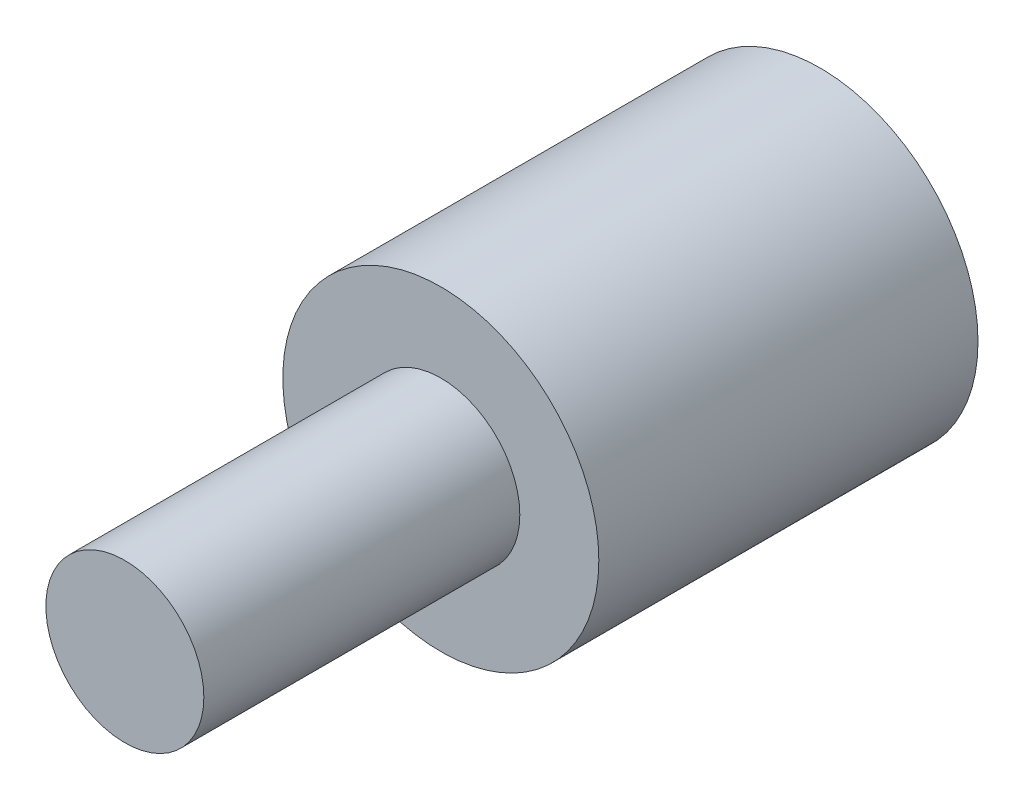
ISO-10303-21;
HEADER;
FILE_DESCRIPTION(('STEP AP214'),'2;1');
FILE_NAME('part.step','',(''),(''),'','','');
FILE_SCHEMA(('AUTOMOTIVE_DESIGN { 1 0 10303 214 1 1 1 1 }'));
ENDSEC;
DATA;
#1=APPLICATION_CONTEXT('core data for automotive mechanical design processes');
#2=APPLICATION_PROTOCOL_DEFINITION('international standard','automotive_design',2000,#1);
#3=PRODUCT_CONTEXT('',#1,'mechanical');
#4=PRODUCT('Part','Part','',(#3));
#5=PRODUCT_RELATED_PRODUCT_CATEGORY('part','',(#4));
#6=PRODUCT_DEFINITION_FORMATION('','',#4);
#7=PRODUCT_DEFINITION_CONTEXT('part definition',#1,'design');
#8=PRODUCT_DEFINITION('design','',#6,#7);
#9=PRODUCT_DEFINITION_SHAPE('','',#8);
#10=(LENGTH_UNIT() NAMED_UNIT(*) SI_UNIT(.MILLI.,.METRE.));
#11=(NAMED_UNIT(*) PLANE_ANGLE_UNIT() SI_UNIT($,.RADIAN.));
#12=(NAMED_UNIT(*) SI_UNIT($,.STERADIAN.) SOLID_ANGLE_UNIT());
#13=UNCERTAINTY_MEASURE_WITH_UNIT(LENGTH_MEASURE(1.E-05),#10,'distance_accuracy_value','');
#14=(GEOMETRIC_REPRESENTATION_CONTEXT(3) GLOBAL_UNCERTAINTY_ASSIGNED_CONTEXT((#13)) GLOBAL_UNIT_ASSIGNED_CONTEXT((#10,
#11,#12)) REPRESENTATION_CONTEXT('',''));
#15=CARTESIAN_POINT('',(0.,0.,0.));
#16=DIRECTION('',(0.,0.,1.));
#17=DIRECTION('',(1.,0.,0.));
#18=AXIS2_PLACEMENT_3D('',#15,#16,#17);
#19=CARTESIAN_POINT('',(0.,0.,-60.));
#20=DIRECTION('',(0.,0.,1.));
#21=DIRECTION('',(1.,0.,0.));
#22=AXIS2_PLACEMENT_3D('',#19,#20,#21);
#23=CYLINDRICAL_SURFACE('',#22,25.);
#24=CARTESIAN_POINT('',(0.,0.,-60.));
#25=DIRECTION('',(0.,0.,1.));
#26=DIRECTION('',(1.,0.,0.));
#27=AXIS2_PLACEMENT_3D('',#24,#25,#26);
#28=CIRCLE('',#27,25.);
#29=CARTESIAN_POINT('',(25.,0.,-60.));
#30=VERTEX_POINT('',#29);
#31=EDGE_CURVE('E45',#30,#30,#28,.T.);
#32=CARTESIAN_POINT('',(0.,0.,0.));
#33=DIRECTION('',(0.,0.,1.));
#34=DIRECTION('',(1.,0.,0.));
#35=AXIS2_PLACEMENT_3D('',#32,#33,#34);
#36=CIRCLE('',#35,25.);
#37=CARTESIAN_POINT('',(25.,0.,0.));
#38=VERTEX_POINT('',#37);
#39=EDGE_CURVE('E40',#38,#38,#36,.T.);
#40=CARTESIAN_POINT('',(25.,0.,-60.));
#41=CARTESIAN_POINT('',(25.,0.,-59.375));
#42=CARTESIAN_POINT('',(25.,0.,-58.75));
#43=CARTESIAN_POINT('',(25.,0.,-57.5));
#44=CARTESIAN_POINT('',(25.,0.,-56.875));
#45=CARTESIAN_POINT('',(25.,0.,-55.625));
#46=CARTESIAN_POINT('',(25.,0.,-55.));
#47=CARTESIAN_POINT('',(25.,0.,-53.75));
#48=CARTESIAN_POINT('',(25.,0.,-53.125));
#49=CARTESIAN_POINT('',(25.,0.,-51.875));
#50=CARTESIAN_POINT('',(25.,0.,-51.25));
#51=CARTESIAN_POINT('',(25.,0.,-50.));
#52=CARTESIAN_POINT('',(25.,0.,-49.375));
#53=CARTESIAN_POINT('',(25.,0.,-48.125));
#54=CARTESIAN_POINT('',(25.,0.,-47.5));
#55=CARTESIAN_POINT('',(25.,0.,-46.25));
#56=CARTESIAN_POINT('',(25.,0.,-45.625));
#57=CARTESIAN_POINT('',(25.,0.,-44.375));
#58=CARTESIAN_POINT('',(25.,0.,-43.75));
#59=CARTESIAN_POINT('',(25.,0.,-42.5));
#60=CARTESIAN_POINT('',(25.,0.,-41.875));
#61=CARTESIAN_POINT('',(25.,0.,-40.625));
#62=CARTESIAN_POINT('',(25.,0.,-40.));
#63=CARTESIAN_POINT('',(25.,0.,-38.75));
#64=CARTESIAN_POINT('',(25.,0.,-38.125));
#65=CARTESIAN_POINT('',(25.,0.,-36.875));
#66=CARTESIAN_POINT('',(25.,0.,-36.25));
#67=CARTESIAN_POINT('',(25.,0.,-35.));
#68=CARTESIAN_POINT('',(25.,0.,-34.375));
#69=CARTESIAN_POINT('',(25.,0.,-33.125));
#70=CARTESIAN_POINT('',(25.,0.,-32.5));
#71=CARTESIAN_POINT('',(25.,0.,-31.25));
#72=CARTESIAN_POINT('',(25.,0.,-30.625));
#73=CARTESIAN_POINT('',(25.,0.,-29.375));
#74=CARTESIAN_POINT('',(25.,0.,-28.75));
#75=CARTESIAN_POINT('',(25.,0.,-27.5));
#76=CARTESIAN_POINT('',(25.,0.,-26.875));
#77=CARTESIAN_POINT('',(25.,0.,-25.625));
#78=CARTESIAN_POINT('',(25.,0.,-25.));
#79=CARTESIAN_POINT('',(25.,0.,-23.75));
#80=CARTESIAN_POINT('',(25.,0.,-23.125));
#81=CARTESIAN_POINT('',(25.,0.,-21.875));
#82=CARTESIAN_POINT('',(25.,0.,-21.25));
#83=CARTESIAN_POINT('',(25.,0.,-20.));
#84=CARTESIAN_POINT('',(25.,0.,-19.375));
#85=CARTESIAN_POINT('',(25.,0.,-18.125));
#86=CARTESIAN_POINT('',(25.,0.,-17.5));
#87=CARTESIAN_POINT('',(25.,0.,-16.25));
#88=CARTESIAN_POINT('',(25.,0.,-15.625));
#89=CARTESIAN_POINT('',(25.,0.,-14.375));
#90=CARTESIAN_POINT('',(25.,0.,-13.75));
#91=CARTESIAN_POINT('',(25.,0.,-12.5));
#92=CARTESIAN_POINT('',(25.,0.,-11.875));
#93=CARTESIAN_POINT('',(25.,0.,-10.625));
#94=CARTESIAN_POINT('',(25.,0.,-10.));
#95=CARTESIAN_POINT('',(25.,0.,-8.75));
#96=CARTESIAN_POINT('',(25.,0.,-8.125));
#97=CARTESIAN_POINT('',(25.,0.,-6.875));
#98=CARTESIAN_POINT('',(25.,0.,-6.25));
#99=CARTESIAN_POINT('',(25.,0.,-5.));
#100=CARTESIAN_POINT('',(25.,0.,-4.375));
#101=CARTESIAN_POINT('',(25.,0.,-3.125));
#102=CARTESIAN_POINT('',(25.,0.,-2.5));
#103=CARTESIAN_POINT('',(25.,0.,-1.25));
#104=CARTESIAN_POINT('',(25.,0.,-0.625000000000001));
#105=CARTESIAN_POINT('',(25.,0.,0.));
#106=B_SPLINE_CURVE_WITH_KNOTS('',3,(#40,#41,#42,#43,#44,#45,#46,#47,#48,#49,#50,#51,#52,#53,
#54,#55,#56,#57,#58,#59,#60,#61,#62,#63,#64,#65,#66,#67,#68,#69,#70,#71,#72,#73,#74,#75,#76,#77,
#78,#79,#80,#81,#82,#83,#84,#85,#86,#87,#88,#89,#90,#91,#92,#93,#94,#95,#96,#97,#98,#99,#100,
#101,#102,#103,#104,#105),.UNSPECIFIED.,.F.,.F.,(4,2,2,2,2,2,2,2,2,2,2,2,2,2,2,2,2,2,2,2,2,2,2,
2,2,2,2,2,2,2,2,2,4),(0.,1.875,3.75,5.62500000000001,7.50000000000001,9.37500000000001,11.25,
13.125,15.,16.875,18.75,20.625,22.5,24.375,26.25,28.125,30.,31.875,33.75,35.625,37.5,39.375,
41.25,43.125,45.,46.875,48.75,50.625,52.5,54.375,56.25,58.125,60.),.UNSPECIFIED.);
#107=EDGE_CURVE('BSEAM37',#30,#38,#106,.T.);
#108=ORIENTED_EDGE('',*,*,#31,.T.);
#109=ORIENTED_EDGE('',*,*,#39,.F.);
#110=ORIENTED_EDGE('',*,*,#107,.T.);
#111=ORIENTED_EDGE('',*,*,#107,.F.);
#112=EDGE_LOOP('',(#108,#110,#109,#111));
#113=FACE_BOUND('',#112,.T.);
#114=ADVANCED_FACE('F37',(#113),#23,.T.);
#115=CARTESIAN_POINT('',(0.,0.,-60.));
#116=DIRECTION('',(0.,0.,1.));
#117=DIRECTION('',(1.,0.,0.));
#118=AXIS2_PLACEMENT_3D('',#115,#116,#117);
#119=PLANE('',#118);
#120=ORIENTED_EDGE('',*,*,#31,.F.);
#121=EDGE_LOOP('',(#120));
#122=FACE_BOUND('',#121,.T.);
#123=ADVANCED_FACE('F64',(#122),#119,.F.);
#124=CARTESIAN_POINT('',(0.,0.,0.));
#125=DIRECTION('',(0.,0.,1.));
#126=DIRECTION('',(1.,0.,0.));
#127=AXIS2_PLACEMENT_3D('',#124,#125,#126);
#128=PLANE('',#127);
#129=CARTESIAN_POINT('',(0.,0.,0.));
#130=DIRECTION('',(0.,0.,1.));
#131=DIRECTION('',(1.,0.,0.));
#132=AXIS2_PLACEMENT_3D('',#129,#130,#131);
#133=CIRCLE('',#132,12.5);
#134=CARTESIAN_POINT('',(12.5,0.,0.));
#135=VERTEX_POINT('',#134);
#136=EDGE_CURVE('E10',#135,#135,#133,.T.);
#137=ORIENTED_EDGE('',*,*,#136,.F.);
#138=EDGE_LOOP('',(#137));
#139=FACE_BOUND('',#138,.T.);
#140=ORIENTED_EDGE('',*,*,#39,.T.);
#141=EDGE_LOOP('',(#140));
#142=FACE_BOUND('',#141,.T.);
#143=ADVANCED_FACE('F61',(#139,#142),#128,.T.);
#144=CARTESIAN_POINT('',(0.,0.,50.));
#145=DIRECTION('',(0.,0.,-1.));
#146=DIRECTION('',(-1.,0.,0.));
#147=AXIS2_PLACEMENT_3D('',#144,#145,#146);
#148=CYLINDRICAL_SURFACE('',#147,12.5);
#149=CARTESIAN_POINT('',(0.,0.,50.));
#150=DIRECTION('',(0.,0.,1.));
#151=DIRECTION('',(1.,0.,0.));
#152=AXIS2_PLACEMENT_3D('',#149,#150,#151);
#153=CIRCLE('',#152,12.5);
#154=CARTESIAN_POINT('',(12.5,0.,50.));
#155=VERTEX_POINT('',#154);
#156=EDGE_CURVE('E52',#155,#155,#153,.T.);
#157=ORIENTED_EDGE('',*,*,#156,.F.);
#158=EDGE_LOOP('',(#157));
#159=FACE_BOUND('',#158,.T.);
#160=ORIENTED_EDGE('',*,*,#136,.T.);
#161=EDGE_LOOP('',(#160));
#162=FACE_BOUND('',#161,.T.);
#163=ADVANCED_FACE('F75',(#159,#162),#148,.T.);
#164=CARTESIAN_POINT('',(0.,0.,50.));
#165=DIRECTION('',(0.,0.,1.));
#166=DIRECTION('',(1.,0.,0.));
#167=AXIS2_PLACEMENT_3D('',#164,#165,#166);
#168=PLANE('',#167);
#169=ORIENTED_EDGE('',*,*,#156,.T.);
#170=EDGE_LOOP('',(#169));
#171=FACE_BOUND('',#170,.T.);
#172=ADVANCED_FACE('F80',(#171),#168,.T.);
#173=CLOSED_SHELL('',(#114,#123,#143,#163,#172));
#174=MANIFOLD_SOLID_BREP('B2',#173);
#175=ADVANCED_BREP_SHAPE_REPRESENTATION('',(#18,#174),#14);
#176=SHAPE_DEFINITION_REPRESENTATION(#9,#175);
ENDSEC;
END-ISO-10303-21;
